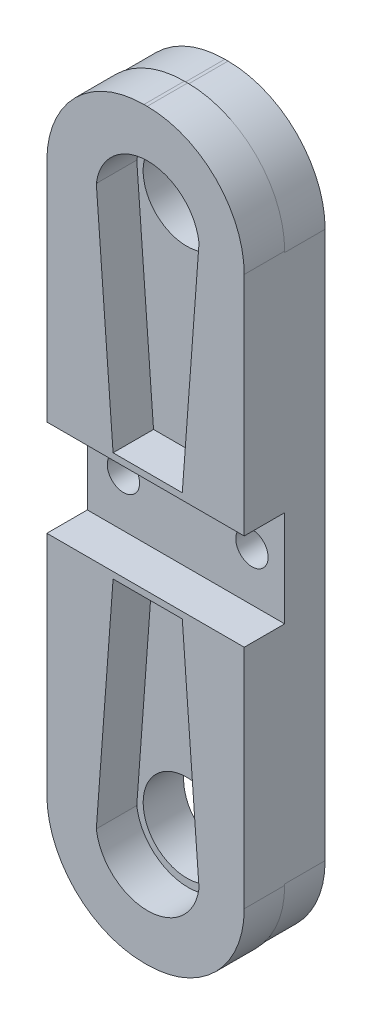
ISO-10303-21;
HEADER;
FILE_DESCRIPTION(('STEP AP214'),'2;1');
FILE_NAME('part.step','',(''),(''),'','','');
FILE_SCHEMA(('AUTOMOTIVE_DESIGN { 1 0 10303 214 1 1 1 1 }'));
ENDSEC;
DATA;
#1=APPLICATION_CONTEXT('core data for automotive mechanical design processes');
#2=APPLICATION_PROTOCOL_DEFINITION('international standard','automotive_design',2000,#1);
#3=PRODUCT_CONTEXT('',#1,'mechanical');
#4=PRODUCT('Part','Part','',(#3));
#5=PRODUCT_RELATED_PRODUCT_CATEGORY('part','',(#4));
#6=PRODUCT_DEFINITION_FORMATION('','',#4);
#7=PRODUCT_DEFINITION_CONTEXT('part definition',#1,'design');
#8=PRODUCT_DEFINITION('design','',#6,#7);
#9=PRODUCT_DEFINITION_SHAPE('','',#8);
#10=(LENGTH_UNIT() NAMED_UNIT(*) SI_UNIT(.MILLI.,.METRE.));
#11=(NAMED_UNIT(*) PLANE_ANGLE_UNIT() SI_UNIT($,.RADIAN.));
#12=(NAMED_UNIT(*) SI_UNIT($,.STERADIAN.) SOLID_ANGLE_UNIT());
#13=UNCERTAINTY_MEASURE_WITH_UNIT(LENGTH_MEASURE(1.E-05),#10,'distance_accuracy_value','');
#14=(GEOMETRIC_REPRESENTATION_CONTEXT(3) GLOBAL_UNCERTAINTY_ASSIGNED_CONTEXT((#13)) GLOBAL_UNIT_ASSIGNED_CONTEXT((#10,
#11,#12)) REPRESENTATION_CONTEXT('',''));
#15=CARTESIAN_POINT('',(0.,0.,0.));
#16=DIRECTION('',(0.,0.,1.));
#17=DIRECTION('',(1.,0.,0.));
#18=AXIS2_PLACEMENT_3D('',#15,#16,#17);
#19=CARTESIAN_POINT('',(0.,0.,12.5));
#20=DIRECTION('',(0.,0.,1.));
#21=DIRECTION('',(1.,0.,0.));
#22=AXIS2_PLACEMENT_3D('',#19,#20,#21);
#23=PLANE('',#22);
#24=CARTESIAN_POINT('',(-185.999682024194,160.057912714201,12.5));
#25=DIRECTION('',(0.,0.,1.));
#26=DIRECTION('',(1.,0.,0.));
#27=AXIS2_PLACEMENT_3D('',#24,#25,#26);
#28=CIRCLE('',#27,1.00000000000002);
#29=CARTESIAN_POINT('',(-184.999682024194,160.057912714201,12.5));
#30=VERTEX_POINT('',#29);
#31=EDGE_CURVE('E298',#30,#30,#28,.T.);
#32=ORIENTED_EDGE('',*,*,#31,.F.);
#33=EDGE_LOOP('',(#32));
#34=FACE_BOUND('',#33,.T.);
#35=CARTESIAN_POINT('',(-178.054871455837,160.057912714201,12.5));
#36=DIRECTION('',(0.,0.,1.));
#37=DIRECTION('',(1.,0.,0.));
#38=AXIS2_PLACEMENT_3D('',#35,#36,#37);
#39=CIRCLE('',#38,0.999999999999998);
#40=CARTESIAN_POINT('',(-177.054871455837,160.057912714201,12.5));
#41=VERTEX_POINT('',#40);
#42=EDGE_CURVE('E260',#41,#41,#39,.T.);
#43=ORIENTED_EDGE('',*,*,#42,.F.);
#44=EDGE_LOOP('',(#43));
#45=FACE_BOUND('',#44,.T.);
#46=DIRECTION('',(0.,-1.,0.));
#47=VECTOR('',#46,1.);
#48=CARTESIAN_POINT('',(-188.231179690793,182.888166790523,12.5));
#49=LINE('',#48,#47);
#50=CARTESIAN_POINT('',(-188.231179690793,162.965455297448,12.5));
#51=VERTEX_POINT('',#50);
#52=CARTESIAN_POINT('',(-188.231179690793,157.010878283599,12.5));
#53=VERTEX_POINT('',#52);
#54=EDGE_CURVE('E360',#51,#53,#49,.T.);
#55=ORIENTED_EDGE('',*,*,#54,.T.);
#56=DIRECTION('',(-1.,0.,0.));
#57=VECTOR('',#56,1.);
#58=CARTESIAN_POINT('',(-176.031179690793,157.010878283599,12.5));
#59=LINE('',#58,#57);
#60=CARTESIAN_POINT('',(-176.031179690793,157.010878283599,12.5));
#61=VERTEX_POINT('',#60);
#62=EDGE_CURVE('E319',#61,#53,#59,.T.);
#63=ORIENTED_EDGE('',*,*,#62,.F.);
#64=DIRECTION('',(0.,1.,0.));
#65=VECTOR('',#64,1.);
#66=CARTESIAN_POINT('',(-176.031179690793,182.888166790523,12.5));
#67=LINE('',#66,#65);
#68=CARTESIAN_POINT('',(-176.031179690793,162.965455297448,12.5));
#69=VERTEX_POINT('',#68);
#70=EDGE_CURVE('E366',#61,#69,#67,.T.);
#71=ORIENTED_EDGE('',*,*,#70,.T.);
#72=DIRECTION('',(1.,0.,0.));
#73=VECTOR('',#72,1.);
#74=CARTESIAN_POINT('',(-176.031179690793,162.965455297448,12.5));
#75=LINE('',#74,#73);
#76=EDGE_CURVE('E337',#51,#69,#75,.T.);
#77=ORIENTED_EDGE('',*,*,#76,.F.);
#78=EDGE_LOOP('',(#55,#63,#71,#77));
#79=FACE_BOUND('',#78,.T.);
#80=ADVANCED_FACE('F37',(#34,#45,#79),#23,.T.);
#81=CARTESIAN_POINT('',(-188.231179690793,182.888166790523,12.5));
#82=DIRECTION('',(1.,0.,0.));
#83=DIRECTION('',(0.,0.,-1.));
#84=AXIS2_PLACEMENT_3D('',#81,#82,#83);
#85=PLANE('',#84);
#86=DIRECTION('',(0.,-1.,0.));
#87=VECTOR('',#86,1.);
#88=CARTESIAN_POINT('',(-188.231179690793,157.010878283599,12.5));
#89=LINE('',#88,#87);
#90=CARTESIAN_POINT('',(-188.231179690793,143.088166790523,12.5));
#91=VERTEX_POINT('',#90);
#92=CARTESIAN_POINT('',(-188.231179690793,143.010878283599,12.5));
#93=VERTEX_POINT('',#92);
#94=EDGE_CURVE('E322',#91,#93,#89,.T.);
#95=ORIENTED_EDGE('',*,*,#94,.T.);
#96=DIRECTION('',(0.,0.,-1.));
#97=VECTOR('',#96,1.);
#98=CARTESIAN_POINT('',(-188.231179690793,143.010878283599,12.5));
#99=LINE('',#98,#97);
#100=CARTESIAN_POINT('',(-188.231179690793,143.010878283599,15.));
#101=VERTEX_POINT('',#100);
#102=EDGE_CURVE('E433',#93,#101,#99,.F.);
#103=ORIENTED_EDGE('',*,*,#102,.T.);
#104=DIRECTION('',(0.,-1.,0.));
#105=VECTOR('',#104,1.);
#106=CARTESIAN_POINT('',(-188.231179690793,157.010878283599,15.));
#107=LINE('',#106,#105);
#108=CARTESIAN_POINT('',(-188.231179690793,157.010878283599,15.));
#109=VERTEX_POINT('',#108);
#110=EDGE_CURVE('E311',#109,#101,#107,.T.);
#111=ORIENTED_EDGE('',*,*,#110,.F.);
#112=DIRECTION('',(0.,0.,-1.));
#113=VECTOR('',#112,1.);
#114=CARTESIAN_POINT('',(-188.231179690793,157.010878283599,15.));
#115=LINE('',#114,#113);
#116=EDGE_CURVE('E317',#109,#53,#115,.T.);
#117=ORIENTED_EDGE('',*,*,#116,.T.);
#118=ORIENTED_EDGE('',*,*,#54,.F.);
#119=DIRECTION('',(0.,0.,-1.));
#120=VECTOR('',#119,1.);
#121=CARTESIAN_POINT('',(-188.231179690793,162.965455297448,15.));
#122=LINE('',#121,#120);
#123=CARTESIAN_POINT('',(-188.231179690793,162.965455297448,15.));
#124=VERTEX_POINT('',#123);
#125=EDGE_CURVE('E356',#124,#51,#122,.T.);
#126=ORIENTED_EDGE('',*,*,#125,.F.);
#127=DIRECTION('',(0.,-1.,0.));
#128=VECTOR('',#127,1.);
#129=CARTESIAN_POINT('',(-188.231179690793,162.965455297448,15.));
#130=LINE('',#129,#128);
#131=CARTESIAN_POINT('',(-188.231179690793,176.965455297448,15.));
#132=VERTEX_POINT('',#131);
#133=EDGE_CURVE('E340',#132,#124,#130,.T.);
#134=ORIENTED_EDGE('',*,*,#133,.F.);
#135=DIRECTION('',(0.,0.,-1.));
#136=VECTOR('',#135,1.);
#137=CARTESIAN_POINT('',(-188.231179690793,176.965455297448,12.5));
#138=LINE('',#137,#136);
#139=CARTESIAN_POINT('',(-188.231179690793,176.965455297448,12.5));
#140=VERTEX_POINT('',#139);
#141=EDGE_CURVE('E430',#132,#140,#138,.T.);
#142=ORIENTED_EDGE('',*,*,#141,.T.);
#143=DIRECTION('',(0.,-1.,0.));
#144=VECTOR('',#143,1.);
#145=CARTESIAN_POINT('',(-188.231179690793,162.965455297448,12.5));
#146=LINE('',#145,#144);
#147=CARTESIAN_POINT('',(-188.231179690793,176.888166790523,12.5));
#148=VERTEX_POINT('',#147);
#149=EDGE_CURVE('E350',#140,#148,#146,.T.);
#150=ORIENTED_EDGE('',*,*,#149,.T.);
#151=DIRECTION('',(0.,0.,-1.));
#152=VECTOR('',#151,1.);
#153=CARTESIAN_POINT('',(-188.231179690793,176.888166790523,12.5));
#154=LINE('',#153,#152);
#155=CARTESIAN_POINT('',(-188.231179690793,176.888166790523,10.));
#156=VERTEX_POINT('',#155);
#157=EDGE_CURVE('E411',#148,#156,#154,.T.);
#158=ORIENTED_EDGE('',*,*,#157,.T.);
#159=DIRECTION('',(0.,-1.,0.));
#160=VECTOR('',#159,1.);
#161=CARTESIAN_POINT('',(-188.231179690793,182.888166790523,10.));
#162=LINE('',#161,#160);
#163=CARTESIAN_POINT('',(-188.231179690793,143.088166790523,10.));
#164=VERTEX_POINT('',#163);
#165=EDGE_CURVE('E359',#156,#164,#162,.T.);
#166=ORIENTED_EDGE('',*,*,#165,.T.);
#167=DIRECTION('',(0.,0.,-1.));
#168=VECTOR('',#167,1.);
#169=CARTESIAN_POINT('',(-188.231179690793,143.088166790523,12.5));
#170=LINE('',#169,#168);
#171=EDGE_CURVE('E414',#164,#91,#170,.F.);
#172=ORIENTED_EDGE('',*,*,#171,.T.);
#173=EDGE_LOOP('',(#95,#103,#111,#117,#118,#126,#134,#142,#150,#158,#166,#172));
#174=FACE_BOUND('',#173,.T.);
#175=ADVANCED_FACE('F488',(#174),#85,.F.);
#176=CARTESIAN_POINT('',(-188.231179690793,137.088166790523,12.5));
#177=DIRECTION('',(0.,1.,0.));
#178=DIRECTION('',(0.,0.,1.));
#179=AXIS2_PLACEMENT_3D('',#176,#177,#178);
#180=PLANE('',#179);
#181=DIRECTION('',(1.,0.,0.));
#182=VECTOR('',#181,1.);
#183=CARTESIAN_POINT('',(-188.231179690793,137.088166790523,10.));
#184=LINE('',#183,#182);
#185=CARTESIAN_POINT('',(-182.231179690793,137.088166790523,10.));
#186=VERTEX_POINT('',#185);
#187=CARTESIAN_POINT('',(-182.031179690793,137.088166790523,10.));
#188=VERTEX_POINT('',#187);
#189=EDGE_CURVE('E374',#186,#188,#184,.T.);
#190=ORIENTED_EDGE('',*,*,#189,.T.);
#191=DIRECTION('',(0.,0.,-1.));
#192=VECTOR('',#191,1.);
#193=CARTESIAN_POINT('',(-182.031179690793,137.088166790523,12.5));
#194=LINE('',#193,#192);
#195=CARTESIAN_POINT('',(-182.031179690793,137.088166790523,12.5));
#196=VERTEX_POINT('',#195);
#197=EDGE_CURVE('E397',#188,#196,#194,.F.);
#198=ORIENTED_EDGE('',*,*,#197,.T.);
#199=DIRECTION('',(1.,0.,0.));
#200=VECTOR('',#199,1.);
#201=CARTESIAN_POINT('',(-188.231179690793,137.088166790523,12.5));
#202=LINE('',#201,#200);
#203=CARTESIAN_POINT('',(-182.231179690793,137.088166790523,12.5));
#204=VERTEX_POINT('',#203);
#205=EDGE_CURVE('E362',#204,#196,#202,.T.);
#206=ORIENTED_EDGE('',*,*,#205,.F.);
#207=DIRECTION('',(0.,0.,-1.));
#208=VECTOR('',#207,1.);
#209=CARTESIAN_POINT('',(-182.231179690793,137.088166790523,12.5));
#210=LINE('',#209,#208);
#211=EDGE_CURVE('E394',#204,#186,#210,.T.);
#212=ORIENTED_EDGE('',*,*,#211,.T.);
#213=EDGE_LOOP('',(#190,#198,#206,#212));
#214=FACE_BOUND('',#213,.T.);
#215=ADVANCED_FACE('F498',(#214),#180,.F.);
#216=CARTESIAN_POINT('',(-176.031179690793,182.888166790523,12.5));
#217=DIRECTION('',(-1.,0.,0.));
#218=DIRECTION('',(0.,0.,1.));
#219=AXIS2_PLACEMENT_3D('',#216,#217,#218);
#220=PLANE('',#219);
#221=DIRECTION('',(0.,1.,0.));
#222=VECTOR('',#221,1.);
#223=CARTESIAN_POINT('',(-176.031179690793,157.010878283599,15.));
#224=LINE('',#223,#222);
#225=CARTESIAN_POINT('',(-176.031179690793,143.010878283599,15.));
#226=VERTEX_POINT('',#225);
#227=CARTESIAN_POINT('',(-176.031179690793,157.010878283599,15.));
#228=VERTEX_POINT('',#227);
#229=EDGE_CURVE('E306',#226,#228,#224,.T.);
#230=ORIENTED_EDGE('',*,*,#229,.F.);
#231=DIRECTION('',(0.,0.,-1.));
#232=VECTOR('',#231,1.);
#233=CARTESIAN_POINT('',(-176.031179690793,143.010878283599,12.5));
#234=LINE('',#233,#232);
#235=CARTESIAN_POINT('',(-176.031179690793,143.010878283599,12.5));
#236=VERTEX_POINT('',#235);
#237=EDGE_CURVE('E441',#226,#236,#234,.T.);
#238=ORIENTED_EDGE('',*,*,#237,.T.);
#239=DIRECTION('',(0.,1.,0.));
#240=VECTOR('',#239,1.);
#241=CARTESIAN_POINT('',(-176.031179690793,157.010878283599,12.5));
#242=LINE('',#241,#240);
#243=CARTESIAN_POINT('',(-176.031179690793,143.088166790523,12.5));
#244=VERTEX_POINT('',#243);
#245=EDGE_CURVE('E297',#236,#244,#242,.T.);
#246=ORIENTED_EDGE('',*,*,#245,.T.);
#247=DIRECTION('',(0.,0.,-1.));
#248=VECTOR('',#247,1.);
#249=CARTESIAN_POINT('',(-176.031179690793,143.088166790523,12.5));
#250=LINE('',#249,#248);
#251=CARTESIAN_POINT('',(-176.031179690793,143.088166790523,10.));
#252=VERTEX_POINT('',#251);
#253=EDGE_CURVE('E383',#244,#252,#250,.T.);
#254=ORIENTED_EDGE('',*,*,#253,.T.);
#255=DIRECTION('',(0.,1.,0.));
#256=VECTOR('',#255,1.);
#257=CARTESIAN_POINT('',(-176.031179690793,182.888166790523,10.));
#258=LINE('',#257,#256);
#259=CARTESIAN_POINT('',(-176.031179690793,176.888166790523,10.));
#260=VERTEX_POINT('',#259);
#261=EDGE_CURVE('E377',#252,#260,#258,.T.);
#262=ORIENTED_EDGE('',*,*,#261,.T.);
#263=DIRECTION('',(0.,0.,-1.));
#264=VECTOR('',#263,1.);
#265=CARTESIAN_POINT('',(-176.031179690793,176.888166790523,12.5));
#266=LINE('',#265,#264);
#267=CARTESIAN_POINT('',(-176.031179690793,176.888166790523,12.5));
#268=VERTEX_POINT('',#267);
#269=EDGE_CURVE('E371',#260,#268,#266,.F.);
#270=ORIENTED_EDGE('',*,*,#269,.T.);
#271=DIRECTION('',(0.,1.,0.));
#272=VECTOR('',#271,1.);
#273=CARTESIAN_POINT('',(-176.031179690793,162.965455297448,12.5));
#274=LINE('',#273,#272);
#275=CARTESIAN_POINT('',(-176.031179690793,176.965455297448,12.5));
#276=VERTEX_POINT('',#275);
#277=EDGE_CURVE('E332',#268,#276,#274,.T.);
#278=ORIENTED_EDGE('',*,*,#277,.T.);
#279=DIRECTION('',(0.,0.,-1.));
#280=VECTOR('',#279,1.);
#281=CARTESIAN_POINT('',(-176.031179690793,176.965455297448,12.5));
#282=LINE('',#281,#280);
#283=CARTESIAN_POINT('',(-176.031179690793,176.965455297448,15.));
#284=VERTEX_POINT('',#283);
#285=EDGE_CURVE('E439',#276,#284,#282,.F.);
#286=ORIENTED_EDGE('',*,*,#285,.T.);
#287=DIRECTION('',(0.,1.,0.));
#288=VECTOR('',#287,1.);
#289=CARTESIAN_POINT('',(-176.031179690793,162.965455297448,15.));
#290=LINE('',#289,#288);
#291=CARTESIAN_POINT('',(-176.031179690793,162.965455297448,15.));
#292=VERTEX_POINT('',#291);
#293=EDGE_CURVE('E333',#292,#284,#290,.T.);
#294=ORIENTED_EDGE('',*,*,#293,.F.);
#295=DIRECTION('',(0.,0.,-1.));
#296=VECTOR('',#295,1.);
#297=CARTESIAN_POINT('',(-176.031179690793,162.965455297448,15.));
#298=LINE('',#297,#296);
#299=EDGE_CURVE('E344',#292,#69,#298,.T.);
#300=ORIENTED_EDGE('',*,*,#299,.T.);
#301=ORIENTED_EDGE('',*,*,#70,.F.);
#302=DIRECTION('',(0.,0.,-1.));
#303=VECTOR('',#302,1.);
#304=CARTESIAN_POINT('',(-176.031179690793,157.010878283599,15.));
#305=LINE('',#304,#303);
#306=EDGE_CURVE('E329',#228,#61,#305,.T.);
#307=ORIENTED_EDGE('',*,*,#306,.F.);
#308=EDGE_LOOP('',(#230,#238,#246,#254,#262,#270,#278,#286,#294,#300,#301,#307));
#309=FACE_BOUND('',#308,.T.);
#310=ADVANCED_FACE('F471',(#309),#220,.F.);
#311=CARTESIAN_POINT('',(-188.231179690793,182.888166790523,12.5));
#312=DIRECTION('',(0.,-1.,0.));
#313=DIRECTION('',(0.,0.,-1.));
#314=AXIS2_PLACEMENT_3D('',#311,#312,#313);
#315=PLANE('',#314);
#316=DIRECTION('',(-1.,0.,0.));
#317=VECTOR('',#316,1.);
#318=CARTESIAN_POINT('',(-188.231179690793,182.888166790523,12.5));
#319=LINE('',#318,#317);
#320=CARTESIAN_POINT('',(-182.031179690793,182.888166790523,12.5));
#321=VERTEX_POINT('',#320);
#322=CARTESIAN_POINT('',(-182.231179690793,182.888166790523,12.5));
#323=VERTEX_POINT('',#322);
#324=EDGE_CURVE('E368',#321,#323,#319,.T.);
#325=ORIENTED_EDGE('',*,*,#324,.F.);
#326=DIRECTION('',(0.,0.,-1.));
#327=VECTOR('',#326,1.);
#328=CARTESIAN_POINT('',(-182.031179690793,182.888166790523,12.5));
#329=LINE('',#328,#327);
#330=CARTESIAN_POINT('',(-182.031179690793,182.888166790523,10.));
#331=VERTEX_POINT('',#330);
#332=EDGE_CURVE('E418',#321,#331,#329,.T.);
#333=ORIENTED_EDGE('',*,*,#332,.T.);
#334=DIRECTION('',(-1.,0.,0.));
#335=VECTOR('',#334,1.);
#336=CARTESIAN_POINT('',(-188.231179690793,182.888166790523,10.));
#337=LINE('',#336,#335);
#338=CARTESIAN_POINT('',(-182.231179690793,182.888166790523,10.));
#339=VERTEX_POINT('',#338);
#340=EDGE_CURVE('E363',#331,#339,#337,.T.);
#341=ORIENTED_EDGE('',*,*,#340,.T.);
#342=DIRECTION('',(0.,0.,-1.));
#343=VECTOR('',#342,1.);
#344=CARTESIAN_POINT('',(-182.231179690793,182.888166790523,12.5));
#345=LINE('',#344,#343);
#346=EDGE_CURVE('E416',#339,#323,#345,.F.);
#347=ORIENTED_EDGE('',*,*,#346,.T.);
#348=EDGE_LOOP('',(#325,#333,#341,#347));
#349=FACE_BOUND('',#348,.T.);
#350=ADVANCED_FACE('F480',(#349),#315,.F.);
#351=CARTESIAN_POINT('',(0.,0.,10.));
#352=DIRECTION('',(0.,0.,1.));
#353=DIRECTION('',(1.,0.,0.));
#354=AXIS2_PLACEMENT_3D('',#351,#352,#353);
#355=PLANE('',#354);
#356=CARTESIAN_POINT('',(-182.080577921619,176.900168290309,10.));
#357=DIRECTION('',(0.,0.,1.));
#358=DIRECTION('',(1.,0.,0.));
#359=AXIS2_PLACEMENT_3D('',#356,#357,#358);
#360=CIRCLE('',#359,2.70000000000001);
#361=CARTESIAN_POINT('',(-179.380577921619,176.900168290309,10.));
#362=VERTEX_POINT('',#361);
#363=EDGE_CURVE('E280',#362,#362,#360,.T.);
#364=ORIENTED_EDGE('',*,*,#363,.T.);
#365=EDGE_LOOP('',(#364));
#366=FACE_BOUND('',#365,.T.);
#367=CARTESIAN_POINT('',(-182.080577921619,143.076165290738,10.));
#368=DIRECTION('',(0.,0.,1.));
#369=DIRECTION('',(-1.,0.,0.));
#370=AXIS2_PLACEMENT_3D('',#367,#368,#369);
#371=CIRCLE('',#370,2.70000000000001);
#372=CARTESIAN_POINT('',(-184.780577921619,143.076165290738,10.));
#373=VERTEX_POINT('',#372);
#374=EDGE_CURVE('E883',#373,#373,#371,.T.);
#375=ORIENTED_EDGE('',*,*,#374,.T.);
#376=EDGE_LOOP('',(#375));
#377=FACE_BOUND('',#376,.T.);
#378=CARTESIAN_POINT('',(-185.999682024194,160.057912714201,10.));
#379=DIRECTION('',(0.,0.,1.));
#380=DIRECTION('',(1.,0.,0.));
#381=AXIS2_PLACEMENT_3D('',#378,#379,#380);
#382=CIRCLE('',#381,1.00000000000002);
#383=CARTESIAN_POINT('',(-184.999682024194,160.057912714201,10.));
#384=VERTEX_POINT('',#383);
#385=EDGE_CURVE('E294',#384,#384,#382,.T.);
#386=ORIENTED_EDGE('',*,*,#385,.T.);
#387=EDGE_LOOP('',(#386));
#388=FACE_BOUND('',#387,.T.);
#389=CARTESIAN_POINT('',(-178.054871455837,160.057912714201,10.));
#390=DIRECTION('',(0.,0.,1.));
#391=DIRECTION('',(1.,0.,0.));
#392=AXIS2_PLACEMENT_3D('',#389,#390,#391);
#393=CIRCLE('',#392,0.999999999999998);
#394=CARTESIAN_POINT('',(-177.054871455837,160.057912714201,10.));
#395=VERTEX_POINT('',#394);
#396=EDGE_CURVE('E301',#395,#395,#393,.T.);
#397=ORIENTED_EDGE('',*,*,#396,.T.);
#398=EDGE_LOOP('',(#397));
#399=FACE_BOUND('',#398,.T.);
#400=ORIENTED_EDGE('',*,*,#261,.F.);
#401=CARTESIAN_POINT('',(-182.031179690793,143.088166790523,10.));
#402=DIRECTION('',(0.,0.,1.));
#403=DIRECTION('',(1.,0.,0.));
#404=AXIS2_PLACEMENT_3D('',#401,#402,#403);
#405=CIRCLE('',#404,6.);
#406=EDGE_CURVE('E392',#252,#188,#405,.F.);
#407=ORIENTED_EDGE('',*,*,#406,.T.);
#408=ORIENTED_EDGE('',*,*,#189,.F.);
#409=CARTESIAN_POINT('',(-182.231179690793,143.088166790523,10.));
#410=DIRECTION('',(0.,0.,1.));
#411=DIRECTION('',(1.,0.,0.));
#412=AXIS2_PLACEMENT_3D('',#409,#410,#411);
#413=CIRCLE('',#412,6.);
#414=EDGE_CURVE('E390',#186,#164,#413,.F.);
#415=ORIENTED_EDGE('',*,*,#414,.T.);
#416=ORIENTED_EDGE('',*,*,#165,.F.);
#417=CARTESIAN_POINT('',(-182.231179690793,176.888166790523,10.));
#418=DIRECTION('',(0.,0.,1.));
#419=DIRECTION('',(1.,0.,0.));
#420=AXIS2_PLACEMENT_3D('',#417,#418,#419);
#421=CIRCLE('',#420,6.);
#422=EDGE_CURVE('E386',#156,#339,#421,.F.);
#423=ORIENTED_EDGE('',*,*,#422,.T.);
#424=ORIENTED_EDGE('',*,*,#340,.F.);
#425=CARTESIAN_POINT('',(-182.031179690793,176.888166790523,10.));
#426=DIRECTION('',(0.,0.,1.));
#427=DIRECTION('',(1.,0.,0.));
#428=AXIS2_PLACEMENT_3D('',#425,#426,#427);
#429=CIRCLE('',#428,6.);
#430=EDGE_CURVE('E388',#331,#260,#429,.F.);
#431=ORIENTED_EDGE('',*,*,#430,.T.);
#432=EDGE_LOOP('',(#400,#407,#408,#415,#416,#423,#424,#431));
#433=FACE_BOUND('',#432,.T.);
#434=ADVANCED_FACE('F491',(#366,#377,#388,#399,#433),#355,.F.);
#435=CARTESIAN_POINT('',(-182.031179690793,143.088166790523,12.5));
#436=DIRECTION('',(0.,0.,-1.));
#437=DIRECTION('',(-1.,0.,0.));
#438=AXIS2_PLACEMENT_3D('',#435,#436,#437);
#439=CYLINDRICAL_SURFACE('',#438,6.);
#440=CARTESIAN_POINT('',(-182.031179690793,143.088166790523,12.5));
#441=DIRECTION('',(0.,0.,1.));
#442=DIRECTION('',(1.,0.,0.));
#443=AXIS2_PLACEMENT_3D('',#440,#441,#442);
#444=CIRCLE('',#443,6.);
#445=EDGE_CURVE('E408',#196,#244,#444,.T.);
#446=ORIENTED_EDGE('',*,*,#445,.F.);
#447=ORIENTED_EDGE('',*,*,#197,.F.);
#448=ORIENTED_EDGE('',*,*,#406,.F.);
#449=ORIENTED_EDGE('',*,*,#253,.F.);
#450=EDGE_LOOP('',(#446,#447,#448,#449));
#451=FACE_BOUND('',#450,.T.);
#452=ADVANCED_FACE('F560',(#451),#439,.T.);
#453=CARTESIAN_POINT('',(-182.231179690793,143.088166790523,12.5));
#454=DIRECTION('',(0.,0.,-1.));
#455=DIRECTION('',(-1.,0.,0.));
#456=AXIS2_PLACEMENT_3D('',#453,#454,#455);
#457=CYLINDRICAL_SURFACE('',#456,6.);
#458=CARTESIAN_POINT('',(-182.231179690793,143.088166790523,12.5));
#459=DIRECTION('',(0.,0.,1.));
#460=DIRECTION('',(1.,0.,0.));
#461=AXIS2_PLACEMENT_3D('',#458,#459,#460);
#462=CIRCLE('',#461,6.);
#463=EDGE_CURVE('E405',#91,#204,#462,.T.);
#464=ORIENTED_EDGE('',*,*,#463,.F.);
#465=ORIENTED_EDGE('',*,*,#171,.F.);
#466=ORIENTED_EDGE('',*,*,#414,.F.);
#467=ORIENTED_EDGE('',*,*,#211,.F.);
#468=EDGE_LOOP('',(#464,#465,#466,#467));
#469=FACE_BOUND('',#468,.T.);
#470=ADVANCED_FACE('F495',(#469),#457,.T.);
#471=CARTESIAN_POINT('',(-182.031179690793,176.888166790523,12.5));
#472=DIRECTION('',(0.,0.,-1.));
#473=DIRECTION('',(-1.,0.,0.));
#474=AXIS2_PLACEMENT_3D('',#471,#472,#473);
#475=CYLINDRICAL_SURFACE('',#474,6.);
#476=CARTESIAN_POINT('',(-182.031179690793,176.888166790523,12.5));
#477=DIRECTION('',(0.,0.,1.));
#478=DIRECTION('',(1.,0.,0.));
#479=AXIS2_PLACEMENT_3D('',#476,#477,#478);
#480=CIRCLE('',#479,6.);
#481=EDGE_CURVE('E402',#268,#321,#480,.T.);
#482=ORIENTED_EDGE('',*,*,#481,.F.);
#483=ORIENTED_EDGE('',*,*,#269,.F.);
#484=ORIENTED_EDGE('',*,*,#430,.F.);
#485=ORIENTED_EDGE('',*,*,#332,.F.);
#486=EDGE_LOOP('',(#482,#483,#484,#485));
#487=FACE_BOUND('',#486,.T.);
#488=ADVANCED_FACE('F477',(#487),#475,.T.);
#489=CARTESIAN_POINT('',(-182.231179690793,176.888166790523,12.5));
#490=DIRECTION('',(0.,0.,-1.));
#491=DIRECTION('',(-1.,0.,0.));
#492=AXIS2_PLACEMENT_3D('',#489,#490,#491);
#493=CYLINDRICAL_SURFACE('',#492,6.);
#494=CARTESIAN_POINT('',(-182.231179690793,176.888166790523,12.5));
#495=DIRECTION('',(0.,0.,1.));
#496=DIRECTION('',(1.,0.,0.));
#497=AXIS2_PLACEMENT_3D('',#494,#495,#496);
#498=CIRCLE('',#497,6.);
#499=EDGE_CURVE('E399',#323,#148,#498,.T.);
#500=ORIENTED_EDGE('',*,*,#499,.F.);
#501=ORIENTED_EDGE('',*,*,#346,.F.);
#502=ORIENTED_EDGE('',*,*,#422,.F.);
#503=ORIENTED_EDGE('',*,*,#157,.F.);
#504=EDGE_LOOP('',(#500,#501,#502,#503));
#505=FACE_BOUND('',#504,.T.);
#506=ADVANCED_FACE('F485',(#505),#493,.T.);
#507=CARTESIAN_POINT('',(0.,0.,12.5));
#508=DIRECTION('',(0.,0.,1.));
#509=DIRECTION('',(1.,0.,0.));
#510=AXIS2_PLACEMENT_3D('',#507,#508,#509);
#511=PLANE('',#510);
#512=ORIENTED_EDGE('',*,*,#149,.F.);
#513=CARTESIAN_POINT('',(-182.231179690793,176.965455297448,12.5));
#514=DIRECTION('',(0.,0.,1.));
#515=DIRECTION('',(1.,0.,0.));
#516=AXIS2_PLACEMENT_3D('',#513,#514,#515);
#517=CIRCLE('',#516,6.);
#518=CARTESIAN_POINT('',(-182.231179690793,182.965455297448,12.5));
#519=VERTEX_POINT('',#518);
#520=EDGE_CURVE('E446',#140,#519,#517,.F.);
#521=ORIENTED_EDGE('',*,*,#520,.T.);
#522=DIRECTION('',(-1.,0.,0.));
#523=VECTOR('',#522,1.);
#524=CARTESIAN_POINT('',(-176.031179690793,182.965455297448,12.5));
#525=LINE('',#524,#523);
#526=CARTESIAN_POINT('',(-182.031179690793,182.965455297448,12.5));
#527=VERTEX_POINT('',#526);
#528=EDGE_CURVE('E347',#527,#519,#525,.T.);
#529=ORIENTED_EDGE('',*,*,#528,.F.);
#530=CARTESIAN_POINT('',(-182.031179690793,176.965455297448,12.5));
#531=DIRECTION('',(0.,0.,1.));
#532=DIRECTION('',(1.,0.,0.));
#533=AXIS2_PLACEMENT_3D('',#530,#531,#532);
#534=CIRCLE('',#533,6.);
#535=EDGE_CURVE('E444',#527,#276,#534,.F.);
#536=ORIENTED_EDGE('',*,*,#535,.T.);
#537=ORIENTED_EDGE('',*,*,#277,.F.);
#538=ORIENTED_EDGE('',*,*,#481,.T.);
#539=ORIENTED_EDGE('',*,*,#324,.T.);
#540=ORIENTED_EDGE('',*,*,#499,.T.);
#541=EDGE_LOOP('',(#512,#521,#529,#536,#537,#538,#539,#540));
#542=FACE_BOUND('',#541,.T.);
#543=ADVANCED_FACE('F468',(#542),#511,.F.);
#544=CARTESIAN_POINT('',(-176.031179690793,182.965455297448,15.));
#545=DIRECTION('',(0.,-1.,0.));
#546=DIRECTION('',(0.,0.,-1.));
#547=AXIS2_PLACEMENT_3D('',#544,#545,#546);
#548=PLANE('',#547);
#549=ORIENTED_EDGE('',*,*,#528,.T.);
#550=DIRECTION('',(0.,0.,-1.));
#551=VECTOR('',#550,1.);
#552=CARTESIAN_POINT('',(-182.231179690793,182.965455297448,15.));
#553=LINE('',#552,#551);
#554=CARTESIAN_POINT('',(-182.231179690793,182.965455297448,15.));
#555=VERTEX_POINT('',#554);
#556=EDGE_CURVE('E451',#519,#555,#553,.F.);
#557=ORIENTED_EDGE('',*,*,#556,.T.);
#558=DIRECTION('',(-1.,0.,0.));
#559=VECTOR('',#558,1.);
#560=CARTESIAN_POINT('',(-176.031179690793,182.965455297448,15.));
#561=LINE('',#560,#559);
#562=CARTESIAN_POINT('',(-182.031179690793,182.965455297448,15.));
#563=VERTEX_POINT('',#562);
#564=EDGE_CURVE('E336',#563,#555,#561,.T.);
#565=ORIENTED_EDGE('',*,*,#564,.F.);
#566=DIRECTION('',(0.,0.,-1.));
#567=VECTOR('',#566,1.);
#568=CARTESIAN_POINT('',(-182.031179690793,182.965455297448,15.));
#569=LINE('',#568,#567);
#570=EDGE_CURVE('E448',#563,#527,#569,.T.);
#571=ORIENTED_EDGE('',*,*,#570,.T.);
#572=EDGE_LOOP('',(#549,#557,#565,#571));
#573=FACE_BOUND('',#572,.T.);
#574=ADVANCED_FACE('F462',(#573),#548,.F.);
#575=CARTESIAN_POINT('',(-176.031179690793,162.965455297448,15.));
#576=DIRECTION('',(0.,1.,0.));
#577=DIRECTION('',(0.,0.,1.));
#578=AXIS2_PLACEMENT_3D('',#575,#576,#577);
#579=PLANE('',#578);
#580=ORIENTED_EDGE('',*,*,#76,.T.);
#581=ORIENTED_EDGE('',*,*,#299,.F.);
#582=DIRECTION('',(1.,0.,0.));
#583=VECTOR('',#582,1.);
#584=CARTESIAN_POINT('',(-176.031179690793,162.965455297448,15.));
#585=LINE('',#584,#583);
#586=EDGE_CURVE('E342',#124,#292,#585,.T.);
#587=ORIENTED_EDGE('',*,*,#586,.F.);
#588=ORIENTED_EDGE('',*,*,#125,.T.);
#589=EDGE_LOOP('',(#580,#581,#587,#588));
#590=FACE_BOUND('',#589,.T.);
#591=ADVANCED_FACE('F534',(#590),#579,.F.);
#592=CARTESIAN_POINT('',(0.,0.,15.));
#593=DIRECTION('',(0.,0.,1.));
#594=DIRECTION('',(1.,0.,0.));
#595=AXIS2_PLACEMENT_3D('',#592,#593,#594);
#596=PLANE('',#595);
#597=DIRECTION('',(0.074379950661477,-0.997229974950411,0.));
#598=VECTOR('',#597,1.);
#599=CARTESIAN_POINT('',(-184.138427734375,163.365707397461,15.));
#600=LINE('',#599,#598);
#601=CARTESIAN_POINT('',(-185.175109863281,177.264755249023,15.));
#602=VERTEX_POINT('',#601);
#603=CARTESIAN_POINT('',(-184.138427734375,163.365707397461,15.));
#604=VERTEX_POINT('',#603);
#605=EDGE_CURVE('E52',#602,#604,#600,.T.);
#606=ORIENTED_EDGE('',*,*,#605,.F.);
#607=CARTESIAN_POINT('',(-182.,176.858526491128,15.));
#608=DIRECTION('',(0.,0.,1.));
#609=DIRECTION('',(-1.,0.,0.));
#610=AXIS2_PLACEMENT_3D('',#607,#608,#609);
#611=CIRCLE('',#610,3.2009911664431);
#612=CARTESIAN_POINT('',(-178.824890136719,177.264755249023,15.));
#613=VERTEX_POINT('',#612);
#614=EDGE_CURVE('E241',#613,#602,#611,.T.);
#615=ORIENTED_EDGE('',*,*,#614,.F.);
#616=DIRECTION('',(0.074379950661475,0.997229974950411,0.));
#617=VECTOR('',#616,1.);
#618=CARTESIAN_POINT('',(-179.861572265625,163.365707397461,15.));
#619=LINE('',#618,#617);
#620=CARTESIAN_POINT('',(-179.861572265625,163.365707397461,15.));
#621=VERTEX_POINT('',#620);
#622=EDGE_CURVE('E244',#621,#613,#619,.T.);
#623=ORIENTED_EDGE('',*,*,#622,.F.);
#624=DIRECTION('',(1.,0.,0.));
#625=VECTOR('',#624,1.);
#626=CARTESIAN_POINT('',(-184.138427734375,163.365707397461,15.));
#627=LINE('',#626,#625);
#628=EDGE_CURVE('E253',#604,#621,#627,.T.);
#629=ORIENTED_EDGE('',*,*,#628,.F.);
#630=EDGE_LOOP('',(#606,#615,#623,#629));
#631=FACE_BOUND('',#630,.T.);
#632=ORIENTED_EDGE('',*,*,#564,.T.);
#633=CARTESIAN_POINT('',(-182.231179690793,176.965455297448,15.));
#634=DIRECTION('',(0.,0.,1.));
#635=DIRECTION('',(1.,0.,0.));
#636=AXIS2_PLACEMENT_3D('',#633,#634,#635);
#637=CIRCLE('',#636,6.);
#638=EDGE_CURVE('E11',#555,#132,#637,.T.);
#639=ORIENTED_EDGE('',*,*,#638,.T.);
#640=ORIENTED_EDGE('',*,*,#133,.T.);
#641=ORIENTED_EDGE('',*,*,#586,.T.);
#642=ORIENTED_EDGE('',*,*,#293,.T.);
#643=CARTESIAN_POINT('',(-182.031179690793,176.965455297448,15.));
#644=DIRECTION('',(0.,0.,1.));
#645=DIRECTION('',(1.,0.,0.));
#646=AXIS2_PLACEMENT_3D('',#643,#644,#645);
#647=CIRCLE('',#646,6.);
#648=EDGE_CURVE('E45',#284,#563,#647,.T.);
#649=ORIENTED_EDGE('',*,*,#648,.T.);
#650=EDGE_LOOP('',(#632,#639,#640,#641,#642,#649));
#651=FACE_BOUND('',#650,.T.);
#652=ADVANCED_FACE('F455',(#631,#651),#596,.T.);
#653=CARTESIAN_POINT('',(-176.031179690793,157.010878283599,15.));
#654=DIRECTION('',(0.,-1.,0.));
#655=DIRECTION('',(0.,0.,-1.));
#656=AXIS2_PLACEMENT_3D('',#653,#654,#655);
#657=PLANE('',#656);
#658=ORIENTED_EDGE('',*,*,#62,.T.);
#659=ORIENTED_EDGE('',*,*,#116,.F.);
#660=DIRECTION('',(-1.,0.,0.));
#661=VECTOR('',#660,1.);
#662=CARTESIAN_POINT('',(-176.031179690793,157.010878283599,15.));
#663=LINE('',#662,#661);
#664=EDGE_CURVE('E308',#228,#109,#663,.T.);
#665=ORIENTED_EDGE('',*,*,#664,.F.);
#666=ORIENTED_EDGE('',*,*,#306,.T.);
#667=EDGE_LOOP('',(#658,#659,#665,#666));
#668=FACE_BOUND('',#667,.T.);
#669=ADVANCED_FACE('F526',(#668),#657,.F.);
#670=CARTESIAN_POINT('',(-176.031179690793,137.010878283599,15.));
#671=DIRECTION('',(0.,1.,0.));
#672=DIRECTION('',(0.,0.,1.));
#673=AXIS2_PLACEMENT_3D('',#670,#671,#672);
#674=PLANE('',#673);
#675=DIRECTION('',(1.,0.,0.));
#676=VECTOR('',#675,1.);
#677=CARTESIAN_POINT('',(-176.031179690793,137.010878283599,15.));
#678=LINE('',#677,#676);
#679=CARTESIAN_POINT('',(-182.231179690793,137.010878283599,15.));
#680=VERTEX_POINT('',#679);
#681=CARTESIAN_POINT('',(-182.031179690793,137.010878283599,15.));
#682=VERTEX_POINT('',#681);
#683=EDGE_CURVE('E314',#680,#682,#678,.T.);
#684=ORIENTED_EDGE('',*,*,#683,.F.);
#685=DIRECTION('',(0.,0.,-1.));
#686=VECTOR('',#685,1.);
#687=CARTESIAN_POINT('',(-182.231179690793,137.010878283599,15.));
#688=LINE('',#687,#686);
#689=CARTESIAN_POINT('',(-182.231179690793,137.010878283599,12.5));
#690=VERTEX_POINT('',#689);
#691=EDGE_CURVE('E423',#680,#690,#688,.T.);
#692=ORIENTED_EDGE('',*,*,#691,.T.);
#693=DIRECTION('',(1.,0.,0.));
#694=VECTOR('',#693,1.);
#695=CARTESIAN_POINT('',(-176.031179690793,137.010878283599,12.5));
#696=LINE('',#695,#694);
#697=CARTESIAN_POINT('',(-182.031179690793,137.010878283599,12.5));
#698=VERTEX_POINT('',#697);
#699=EDGE_CURVE('E309',#690,#698,#696,.T.);
#700=ORIENTED_EDGE('',*,*,#699,.T.);
#701=DIRECTION('',(0.,0.,-1.));
#702=VECTOR('',#701,1.);
#703=CARTESIAN_POINT('',(-182.031179690793,137.010878283599,15.));
#704=LINE('',#703,#702);
#705=EDGE_CURVE('E421',#698,#682,#704,.F.);
#706=ORIENTED_EDGE('',*,*,#705,.T.);
#707=EDGE_LOOP('',(#684,#692,#700,#706));
#708=FACE_BOUND('',#707,.T.);
#709=ADVANCED_FACE('F516',(#708),#674,.F.);
#710=CARTESIAN_POINT('',(0.,0.,15.));
#711=DIRECTION('',(0.,0.,-1.));
#712=DIRECTION('',(-1.,0.,0.));
#713=AXIS2_PLACEMENT_3D('',#710,#711,#712);
#714=PLANE('',#713);
#715=DIRECTION('',(-0.074379950661477,-0.997229974950411,0.));
#716=VECTOR('',#715,1.);
#717=CARTESIAN_POINT('',(-184.138427734375,156.610626183586,15.));
#718=LINE('',#717,#716);
#719=CARTESIAN_POINT('',(-184.138427734375,156.610626183586,15.));
#720=VERTEX_POINT('',#719);
#721=CARTESIAN_POINT('',(-185.175109863281,142.711578332023,15.));
#722=VERTEX_POINT('',#721);
#723=EDGE_CURVE('E279',#720,#722,#718,.T.);
#724=ORIENTED_EDGE('',*,*,#723,.F.);
#725=DIRECTION('',(-1.,0.,0.));
#726=VECTOR('',#725,1.);
#727=CARTESIAN_POINT('',(-184.138427734375,156.610626183586,15.));
#728=LINE('',#727,#726);
#729=CARTESIAN_POINT('',(-179.861572265625,156.610626183586,15.));
#730=VERTEX_POINT('',#729);
#731=EDGE_CURVE('E60',#730,#720,#728,.T.);
#732=ORIENTED_EDGE('',*,*,#731,.F.);
#733=DIRECTION('',(-0.074379950661475,0.997229974950411,0.));
#734=VECTOR('',#733,1.);
#735=CARTESIAN_POINT('',(-179.861572265625,156.610626183586,15.));
#736=LINE('',#735,#734);
#737=CARTESIAN_POINT('',(-178.824890136719,142.711578332023,15.));
#738=VERTEX_POINT('',#737);
#739=EDGE_CURVE('E268',#738,#730,#736,.T.);
#740=ORIENTED_EDGE('',*,*,#739,.F.);
#741=CARTESIAN_POINT('',(-182.,143.117807089918,15.));
#742=DIRECTION('',(0.,0.,1.));
#743=DIRECTION('',(1.,0.,0.));
#744=AXIS2_PLACEMENT_3D('',#741,#742,#743);
#745=CIRCLE('',#744,3.2009911664431);
#746=EDGE_CURVE('E283',#722,#738,#745,.T.);
#747=ORIENTED_EDGE('',*,*,#746,.F.);
#748=EDGE_LOOP('',(#724,#732,#740,#747));
#749=FACE_BOUND('',#748,.T.);
#750=ORIENTED_EDGE('',*,*,#110,.T.);
#751=CARTESIAN_POINT('',(-182.231179690793,143.010878283599,15.));
#752=DIRECTION('',(0.,0.,-1.));
#753=DIRECTION('',(-1.,0.,0.));
#754=AXIS2_PLACEMENT_3D('',#751,#752,#753);
#755=CIRCLE('',#754,6.);
#756=EDGE_CURVE('E437',#101,#680,#755,.F.);
#757=ORIENTED_EDGE('',*,*,#756,.T.);
#758=ORIENTED_EDGE('',*,*,#683,.T.);
#759=CARTESIAN_POINT('',(-182.031179690793,143.010878283599,15.));
#760=DIRECTION('',(0.,0.,-1.));
#761=DIRECTION('',(-1.,0.,0.));
#762=AXIS2_PLACEMENT_3D('',#759,#760,#761);
#763=CIRCLE('',#762,6.);
#764=EDGE_CURVE('E435',#682,#226,#763,.F.);
#765=ORIENTED_EDGE('',*,*,#764,.T.);
#766=ORIENTED_EDGE('',*,*,#229,.T.);
#767=ORIENTED_EDGE('',*,*,#664,.T.);
#768=EDGE_LOOP('',(#750,#757,#758,#765,#766,#767));
#769=FACE_BOUND('',#768,.T.);
#770=ADVANCED_FACE('F513',(#749,#769),#714,.F.);
#771=CARTESIAN_POINT('',(0.,0.,12.5));
#772=DIRECTION('',(0.,0.,-1.));
#773=DIRECTION('',(-1.,0.,0.));
#774=AXIS2_PLACEMENT_3D('',#771,#772,#773);
#775=PLANE('',#774);
#776=ORIENTED_EDGE('',*,*,#699,.F.);
#777=CARTESIAN_POINT('',(-182.231179690793,143.010878283599,12.5));
#778=DIRECTION('',(0.,0.,-1.));
#779=DIRECTION('',(-1.,0.,0.));
#780=AXIS2_PLACEMENT_3D('',#777,#778,#779);
#781=CIRCLE('',#780,6.);
#782=EDGE_CURVE('E428',#690,#93,#781,.T.);
#783=ORIENTED_EDGE('',*,*,#782,.T.);
#784=ORIENTED_EDGE('',*,*,#94,.F.);
#785=ORIENTED_EDGE('',*,*,#463,.T.);
#786=ORIENTED_EDGE('',*,*,#205,.T.);
#787=ORIENTED_EDGE('',*,*,#445,.T.);
#788=ORIENTED_EDGE('',*,*,#245,.F.);
#789=CARTESIAN_POINT('',(-182.031179690793,143.010878283599,12.5));
#790=DIRECTION('',(0.,0.,-1.));
#791=DIRECTION('',(-1.,0.,0.));
#792=AXIS2_PLACEMENT_3D('',#789,#790,#791);
#793=CIRCLE('',#792,6.);
#794=EDGE_CURVE('E426',#236,#698,#793,.T.);
#795=ORIENTED_EDGE('',*,*,#794,.T.);
#796=EDGE_LOOP('',(#776,#783,#784,#785,#786,#787,#788,#795));
#797=FACE_BOUND('',#796,.T.);
#798=ADVANCED_FACE('F504',(#797),#775,.T.);
#799=CARTESIAN_POINT('',(-182.231179690793,143.010878283599,15.));
#800=DIRECTION('',(0.,0.,-1.));
#801=DIRECTION('',(-1.,0.,0.));
#802=AXIS2_PLACEMENT_3D('',#799,#800,#801);
#803=CYLINDRICAL_SURFACE('',#802,6.);
#804=ORIENTED_EDGE('',*,*,#756,.F.);
#805=ORIENTED_EDGE('',*,*,#102,.F.);
#806=ORIENTED_EDGE('',*,*,#782,.F.);
#807=ORIENTED_EDGE('',*,*,#691,.F.);
#808=EDGE_LOOP('',(#804,#805,#806,#807));
#809=FACE_BOUND('',#808,.T.);
#810=ADVANCED_FACE('F509',(#809),#803,.T.);
#811=CARTESIAN_POINT('',(-182.031179690793,143.010878283599,12.5));
#812=DIRECTION('',(0.,0.,-1.));
#813=DIRECTION('',(-1.,0.,0.));
#814=AXIS2_PLACEMENT_3D('',#811,#812,#813);
#815=CYLINDRICAL_SURFACE('',#814,6.);
#816=ORIENTED_EDGE('',*,*,#764,.F.);
#817=ORIENTED_EDGE('',*,*,#705,.F.);
#818=ORIENTED_EDGE('',*,*,#794,.F.);
#819=ORIENTED_EDGE('',*,*,#237,.F.);
#820=EDGE_LOOP('',(#816,#817,#818,#819));
#821=FACE_BOUND('',#820,.T.);
#822=ADVANCED_FACE('F519',(#821),#815,.T.);
#823=CARTESIAN_POINT('',(-182.231179690793,176.965455297448,12.5));
#824=DIRECTION('',(0.,0.,-1.));
#825=DIRECTION('',(-1.,0.,0.));
#826=AXIS2_PLACEMENT_3D('',#823,#824,#825);
#827=CYLINDRICAL_SURFACE('',#826,6.);
#828=ORIENTED_EDGE('',*,*,#638,.F.);
#829=ORIENTED_EDGE('',*,*,#556,.F.);
#830=ORIENTED_EDGE('',*,*,#520,.F.);
#831=ORIENTED_EDGE('',*,*,#141,.F.);
#832=EDGE_LOOP('',(#828,#829,#830,#831));
#833=FACE_BOUND('',#832,.T.);
#834=ADVANCED_FACE('F538',(#833),#827,.T.);
#835=CARTESIAN_POINT('',(-182.031179690793,176.965455297448,15.));
#836=DIRECTION('',(0.,0.,-1.));
#837=DIRECTION('',(-1.,0.,0.));
#838=AXIS2_PLACEMENT_3D('',#835,#836,#837);
#839=CYLINDRICAL_SURFACE('',#838,6.);
#840=ORIENTED_EDGE('',*,*,#648,.F.);
#841=ORIENTED_EDGE('',*,*,#285,.F.);
#842=ORIENTED_EDGE('',*,*,#535,.F.);
#843=ORIENTED_EDGE('',*,*,#570,.F.);
#844=EDGE_LOOP('',(#840,#841,#842,#843));
#845=FACE_BOUND('',#844,.T.);
#846=ADVANCED_FACE('F39',(#845),#839,.T.);
#847=CARTESIAN_POINT('',(-178.054871455837,160.057912714201,10.));
#848=DIRECTION('',(0.,0.,1.));
#849=DIRECTION('',(1.,0.,0.));
#850=AXIS2_PLACEMENT_3D('',#847,#848,#849);
#851=CYLINDRICAL_SURFACE('',#850,0.999999999999998);
#852=ORIENTED_EDGE('',*,*,#396,.F.);
#853=EDGE_LOOP('',(#852));
#854=FACE_BOUND('',#853,.T.);
#855=ORIENTED_EDGE('',*,*,#42,.T.);
#856=EDGE_LOOP('',(#855));
#857=FACE_BOUND('',#856,.T.);
#858=ADVANCED_FACE('F544',(#854,#857),#851,.F.);
#859=CARTESIAN_POINT('',(-185.999682024194,160.057912714201,10.));
#860=DIRECTION('',(0.,0.,1.));
#861=DIRECTION('',(1.,0.,0.));
#862=AXIS2_PLACEMENT_3D('',#859,#860,#861);
#863=CYLINDRICAL_SURFACE('',#862,1.00000000000002);
#864=ORIENTED_EDGE('',*,*,#385,.F.);
#865=EDGE_LOOP('',(#864));
#866=FACE_BOUND('',#865,.T.);
#867=ORIENTED_EDGE('',*,*,#31,.T.);
#868=EDGE_LOOP('',(#867));
#869=FACE_BOUND('',#868,.T.);
#870=ADVANCED_FACE('F673',(#866,#869),#863,.F.);
#871=CARTESIAN_POINT('',(-184.138427734375,156.610626183586,12.5));
#872=DIRECTION('',(0.,1.,0.));
#873=DIRECTION('',(0.,0.,1.));
#874=AXIS2_PLACEMENT_3D('',#871,#872,#873);
#875=PLANE('',#874);
#876=ORIENTED_EDGE('',*,*,#731,.T.);
#877=DIRECTION('',(0.,0.,1.));
#878=VECTOR('',#877,1.);
#879=CARTESIAN_POINT('',(-184.138427734375,156.610626183586,12.5));
#880=LINE('',#879,#878);
#881=CARTESIAN_POINT('',(-184.138427734375,156.610626183586,12.5));
#882=VERTEX_POINT('',#881);
#883=EDGE_CURVE('E277',#882,#720,#880,.T.);
#884=ORIENTED_EDGE('',*,*,#883,.F.);
#885=DIRECTION('',(-1.,0.,0.));
#886=VECTOR('',#885,1.);
#887=CARTESIAN_POINT('',(-184.138427734375,156.610626183586,12.5));
#888=LINE('',#887,#886);
#889=CARTESIAN_POINT('',(-179.861572265625,156.610626183586,12.5));
#890=VERTEX_POINT('',#889);
#891=EDGE_CURVE('E264',#890,#882,#888,.T.);
#892=ORIENTED_EDGE('',*,*,#891,.F.);
#893=DIRECTION('',(0.,0.,1.));
#894=VECTOR('',#893,1.);
#895=CARTESIAN_POINT('',(-179.861572265625,156.610626183586,12.5));
#896=LINE('',#895,#894);
#897=EDGE_CURVE('E254',#890,#730,#896,.T.);
#898=ORIENTED_EDGE('',*,*,#897,.T.);
#899=EDGE_LOOP('',(#876,#884,#892,#898));
#900=FACE_BOUND('',#899,.T.);
#901=ADVANCED_FACE('F685',(#900),#875,.F.);
#902=CARTESIAN_POINT('',(-179.861572265625,156.610626183586,12.5));
#903=DIRECTION('',(0.99722997495041,0.074379950661475,0.));
#904=DIRECTION('',(-0.074379950661475,0.997229974950411,0.));
#905=AXIS2_PLACEMENT_3D('',#902,#903,#904);
#906=PLANE('',#905);
#907=ORIENTED_EDGE('',*,*,#739,.T.);
#908=ORIENTED_EDGE('',*,*,#897,.F.);
#909=DIRECTION('',(-0.074379950661475,0.997229974950411,0.));
#910=VECTOR('',#909,1.);
#911=CARTESIAN_POINT('',(-179.861572265625,156.610626183586,12.5));
#912=LINE('',#911,#910);
#913=CARTESIAN_POINT('',(-178.824890136719,142.711578332023,12.5));
#914=VERTEX_POINT('',#913);
#915=EDGE_CURVE('E274',#914,#890,#912,.T.);
#916=ORIENTED_EDGE('',*,*,#915,.F.);
#917=DIRECTION('',(0.,0.,1.));
#918=VECTOR('',#917,1.);
#919=CARTESIAN_POINT('',(-178.824890136719,142.711578332023,12.5));
#920=LINE('',#919,#918);
#921=EDGE_CURVE('E289',#914,#738,#920,.T.);
#922=ORIENTED_EDGE('',*,*,#921,.T.);
#923=EDGE_LOOP('',(#907,#908,#916,#922));
#924=FACE_BOUND('',#923,.T.);
#925=ADVANCED_FACE('F690',(#924),#906,.F.);
#926=CARTESIAN_POINT('',(-182.,143.117807089918,12.5));
#927=DIRECTION('',(0.,0.,1.));
#928=DIRECTION('',(1.,0.,0.));
#929=AXIS2_PLACEMENT_3D('',#926,#927,#928);
#930=CYLINDRICAL_SURFACE('',#929,3.2009911664431);
#931=ORIENTED_EDGE('',*,*,#746,.T.);
#932=ORIENTED_EDGE('',*,*,#921,.F.);
#933=CARTESIAN_POINT('',(-182.,143.117807089918,12.5));
#934=DIRECTION('',(0.,0.,1.));
#935=DIRECTION('',(1.,0.,0.));
#936=AXIS2_PLACEMENT_3D('',#933,#934,#935);
#937=CIRCLE('',#936,3.2009911664431);
#938=CARTESIAN_POINT('',(-185.175109863281,142.711578332023,12.5));
#939=VERTEX_POINT('',#938);
#940=EDGE_CURVE('E271',#939,#914,#937,.T.);
#941=ORIENTED_EDGE('',*,*,#940,.F.);
#942=DIRECTION('',(0.,0.,1.));
#943=VECTOR('',#942,1.);
#944=CARTESIAN_POINT('',(-185.175109863281,142.711578332023,12.5));
#945=LINE('',#944,#943);
#946=EDGE_CURVE('E291',#939,#722,#945,.T.);
#947=ORIENTED_EDGE('',*,*,#946,.T.);
#948=EDGE_LOOP('',(#931,#932,#941,#947));
#949=FACE_BOUND('',#948,.T.);
#950=ADVANCED_FACE('F699',(#949),#930,.F.);
#951=CARTESIAN_POINT('',(-184.138427734375,156.610626183586,12.5));
#952=DIRECTION('',(-0.997229974950411,0.074379950661477,0.));
#953=DIRECTION('',(-0.074379950661477,-0.997229974950411,0.));
#954=AXIS2_PLACEMENT_3D('',#951,#952,#953);
#955=PLANE('',#954);
#956=ORIENTED_EDGE('',*,*,#723,.T.);
#957=ORIENTED_EDGE('',*,*,#946,.F.);
#958=DIRECTION('',(-0.074379950661477,-0.997229974950411,0.));
#959=VECTOR('',#958,1.);
#960=CARTESIAN_POINT('',(-184.138427734375,156.610626183586,12.5));
#961=LINE('',#960,#959);
#962=EDGE_CURVE('E267',#882,#939,#961,.T.);
#963=ORIENTED_EDGE('',*,*,#962,.F.);
#964=ORIENTED_EDGE('',*,*,#883,.T.);
#965=EDGE_LOOP('',(#956,#957,#963,#964));
#966=FACE_BOUND('',#965,.T.);
#967=ADVANCED_FACE('F709',(#966),#955,.F.);
#968=CARTESIAN_POINT('',(-182.,143.117807089918,12.5));
#969=DIRECTION('',(0.,0.,1.));
#970=DIRECTION('',(1.,0.,0.));
#971=AXIS2_PLACEMENT_3D('',#968,#969,#970);
#972=PLANE('',#971);
#973=CARTESIAN_POINT('',(-182.080577921619,143.076165290738,12.5));
#974=DIRECTION('',(0.,0.,1.));
#975=DIRECTION('',(-1.,0.,0.));
#976=AXIS2_PLACEMENT_3D('',#973,#974,#975);
#977=CIRCLE('',#976,2.70000000000001);
#978=CARTESIAN_POINT('',(-184.780577921619,143.076165290738,12.5));
#979=VERTEX_POINT('',#978);
#980=EDGE_CURVE('E247',#979,#979,#977,.T.);
#981=ORIENTED_EDGE('',*,*,#980,.F.);
#982=EDGE_LOOP('',(#981));
#983=FACE_BOUND('',#982,.T.);
#984=ORIENTED_EDGE('',*,*,#891,.T.);
#985=ORIENTED_EDGE('',*,*,#962,.T.);
#986=ORIENTED_EDGE('',*,*,#940,.T.);
#987=ORIENTED_EDGE('',*,*,#915,.T.);
#988=EDGE_LOOP('',(#984,#985,#986,#987));
#989=FACE_BOUND('',#988,.T.);
#990=ADVANCED_FACE('F719',(#983,#989),#972,.T.);
#991=CARTESIAN_POINT('',(-184.138427734375,163.365707397461,12.5));
#992=DIRECTION('',(-0.997229974950411,-0.074379950661477,0.));
#993=DIRECTION('',(0.074379950661477,-0.997229974950411,0.));
#994=AXIS2_PLACEMENT_3D('',#991,#992,#993);
#995=PLANE('',#994);
#996=ORIENTED_EDGE('',*,*,#605,.T.);
#997=DIRECTION('',(0.,0.,1.));
#998=VECTOR('',#997,1.);
#999=CARTESIAN_POINT('',(-184.138427734375,163.365707397461,12.5));
#1000=LINE('',#999,#998);
#1001=CARTESIAN_POINT('',(-184.138427734375,163.365707397461,12.5));
#1002=VERTEX_POINT('',#1001);
#1003=EDGE_CURVE('E219',#1002,#604,#1000,.T.);
#1004=ORIENTED_EDGE('',*,*,#1003,.F.);
#1005=DIRECTION('',(0.074379950661477,-0.997229974950411,0.));
#1006=VECTOR('',#1005,1.);
#1007=CARTESIAN_POINT('',(-184.138427734375,163.365707397461,12.5));
#1008=LINE('',#1007,#1006);
#1009=CARTESIAN_POINT('',(-185.175109863281,177.264755249023,12.5));
#1010=VERTEX_POINT('',#1009);
#1011=EDGE_CURVE('E223',#1010,#1002,#1008,.T.);
#1012=ORIENTED_EDGE('',*,*,#1011,.F.);
#1013=DIRECTION('',(0.,0.,1.));
#1014=VECTOR('',#1013,1.);
#1015=CARTESIAN_POINT('',(-185.175109863281,177.264755249023,12.5));
#1016=LINE('',#1015,#1014);
#1017=EDGE_CURVE('E258',#1010,#602,#1016,.T.);
#1018=ORIENTED_EDGE('',*,*,#1017,.T.);
#1019=EDGE_LOOP('',(#996,#1004,#1012,#1018));
#1020=FACE_BOUND('',#1019,.T.);
#1021=ADVANCED_FACE('F221',(#1020),#995,.F.);
#1022=CARTESIAN_POINT('',(-182.,176.858526491128,12.5));
#1023=DIRECTION('',(0.,0.,1.));
#1024=DIRECTION('',(1.,0.,0.));
#1025=AXIS2_PLACEMENT_3D('',#1022,#1023,#1024);
#1026=CYLINDRICAL_SURFACE('',#1025,3.2009911664431);
#1027=ORIENTED_EDGE('',*,*,#614,.T.);
#1028=ORIENTED_EDGE('',*,*,#1017,.F.);
#1029=CARTESIAN_POINT('',(-182.,176.858526491128,12.5));
#1030=DIRECTION('',(0.,0.,1.));
#1031=DIRECTION('',(-1.,0.,0.));
#1032=AXIS2_PLACEMENT_3D('',#1029,#1030,#1031);
#1033=CIRCLE('',#1032,3.2009911664431);
#1034=CARTESIAN_POINT('',(-178.824890136719,177.264755249023,12.5));
#1035=VERTEX_POINT('',#1034);
#1036=EDGE_CURVE('E229',#1035,#1010,#1033,.T.);
#1037=ORIENTED_EDGE('',*,*,#1036,.F.);
#1038=DIRECTION('',(0.,0.,1.));
#1039=VECTOR('',#1038,1.);
#1040=CARTESIAN_POINT('',(-178.824890136719,177.264755249023,12.5));
#1041=LINE('',#1040,#1039);
#1042=EDGE_CURVE('E261',#1035,#613,#1041,.T.);
#1043=ORIENTED_EDGE('',*,*,#1042,.T.);
#1044=EDGE_LOOP('',(#1027,#1028,#1037,#1043));
#1045=FACE_BOUND('',#1044,.T.);
#1046=ADVANCED_FACE('F731',(#1045),#1026,.F.);
#1047=CARTESIAN_POINT('',(-179.861572265625,163.365707397461,12.5));
#1048=DIRECTION('',(0.99722997495041,-0.074379950661475,0.));
#1049=DIRECTION('',(0.074379950661475,0.997229974950411,0.));
#1050=AXIS2_PLACEMENT_3D('',#1047,#1048,#1049);
#1051=PLANE('',#1050);
#1052=ORIENTED_EDGE('',*,*,#622,.T.);
#1053=ORIENTED_EDGE('',*,*,#1042,.F.);
#1054=DIRECTION('',(0.074379950661475,0.997229974950411,0.));
#1055=VECTOR('',#1054,1.);
#1056=CARTESIAN_POINT('',(-179.861572265625,163.365707397461,12.5));
#1057=LINE('',#1056,#1055);
#1058=CARTESIAN_POINT('',(-179.861572265625,163.365707397461,12.5));
#1059=VERTEX_POINT('',#1058);
#1060=EDGE_CURVE('E237',#1059,#1035,#1057,.T.);
#1061=ORIENTED_EDGE('',*,*,#1060,.F.);
#1062=DIRECTION('',(0.,0.,1.));
#1063=VECTOR('',#1062,1.);
#1064=CARTESIAN_POINT('',(-179.861572265625,163.365707397461,12.5));
#1065=LINE('',#1064,#1063);
#1066=EDGE_CURVE('E228',#1059,#621,#1065,.T.);
#1067=ORIENTED_EDGE('',*,*,#1066,.T.);
#1068=EDGE_LOOP('',(#1052,#1053,#1061,#1067));
#1069=FACE_BOUND('',#1068,.T.);
#1070=ADVANCED_FACE('F740',(#1069),#1051,.F.);
#1071=CARTESIAN_POINT('',(-184.138427734375,163.365707397461,12.5));
#1072=DIRECTION('',(0.,-1.,0.));
#1073=DIRECTION('',(0.,0.,-1.));
#1074=AXIS2_PLACEMENT_3D('',#1071,#1072,#1073);
#1075=PLANE('',#1074);
#1076=ORIENTED_EDGE('',*,*,#628,.T.);
#1077=ORIENTED_EDGE('',*,*,#1066,.F.);
#1078=DIRECTION('',(1.,0.,0.));
#1079=VECTOR('',#1078,1.);
#1080=CARTESIAN_POINT('',(-184.138427734375,163.365707397461,12.5));
#1081=LINE('',#1080,#1079);
#1082=EDGE_CURVE('E232',#1002,#1059,#1081,.T.);
#1083=ORIENTED_EDGE('',*,*,#1082,.F.);
#1084=ORIENTED_EDGE('',*,*,#1003,.T.);
#1085=EDGE_LOOP('',(#1076,#1077,#1083,#1084));
#1086=FACE_BOUND('',#1085,.T.);
#1087=ADVANCED_FACE('F233',(#1086),#1075,.F.);
#1088=CARTESIAN_POINT('',(-182.,176.858526491128,12.5));
#1089=DIRECTION('',(0.,0.,-1.));
#1090=DIRECTION('',(-1.,0.,0.));
#1091=AXIS2_PLACEMENT_3D('',#1088,#1089,#1090);
#1092=PLANE('',#1091);
#1093=CARTESIAN_POINT('',(-182.080577921619,176.900168290309,12.5));
#1094=DIRECTION('',(0.,0.,1.));
#1095=DIRECTION('',(1.,0.,0.));
#1096=AXIS2_PLACEMENT_3D('',#1093,#1094,#1095);
#1097=CIRCLE('',#1096,2.70000000000001);
#1098=CARTESIAN_POINT('',(-179.380577921619,176.900168290309,12.5));
#1099=VERTEX_POINT('',#1098);
#1100=EDGE_CURVE('E885',#1099,#1099,#1097,.T.);
#1101=ORIENTED_EDGE('',*,*,#1100,.F.);
#1102=EDGE_LOOP('',(#1101));
#1103=FACE_BOUND('',#1102,.T.);
#1104=ORIENTED_EDGE('',*,*,#1011,.T.);
#1105=ORIENTED_EDGE('',*,*,#1082,.T.);
#1106=ORIENTED_EDGE('',*,*,#1060,.T.);
#1107=ORIENTED_EDGE('',*,*,#1036,.T.);
#1108=EDGE_LOOP('',(#1104,#1105,#1106,#1107));
#1109=FACE_BOUND('',#1108,.T.);
#1110=ADVANCED_FACE('F239',(#1103,#1109),#1092,.F.);
#1111=CARTESIAN_POINT('',(-182.080577921619,176.900168290309,10.));
#1112=DIRECTION('',(0.,0.,1.));
#1113=DIRECTION('',(1.,0.,0.));
#1114=AXIS2_PLACEMENT_3D('',#1111,#1112,#1113);
#1115=CYLINDRICAL_SURFACE('',#1114,2.70000000000001);
#1116=ORIENTED_EDGE('',*,*,#363,.F.);
#1117=EDGE_LOOP('',(#1116));
#1118=FACE_BOUND('',#1117,.T.);
#1119=ORIENTED_EDGE('',*,*,#1100,.T.);
#1120=EDGE_LOOP('',(#1119));
#1121=FACE_BOUND('',#1120,.T.);
#1122=ADVANCED_FACE('F766',(#1118,#1121),#1115,.F.);
#1123=CARTESIAN_POINT('',(-182.080577921619,143.076165290738,10.));
#1124=DIRECTION('',(0.,0.,1.));
#1125=DIRECTION('',(1.,0.,0.));
#1126=AXIS2_PLACEMENT_3D('',#1123,#1124,#1125);
#1127=CYLINDRICAL_SURFACE('',#1126,2.70000000000001);
#1128=ORIENTED_EDGE('',*,*,#374,.F.);
#1129=EDGE_LOOP('',(#1128));
#1130=FACE_BOUND('',#1129,.T.);
#1131=ORIENTED_EDGE('',*,*,#980,.T.);
#1132=EDGE_LOOP('',(#1131));
#1133=FACE_BOUND('',#1132,.T.);
#1134=ADVANCED_FACE('F773',(#1130,#1133),#1127,.F.);
#1135=CLOSED_SHELL('',(#80,#175,#215,#310,#350,#434,#452,#470,#488,#506,#543,#574,#591,#652,
#669,#709,#770,#798,#810,#822,#834,#846,#858,#870,#901,#925,#950,#967,#990,#1021,#1046,#1070,
#1087,#1110,#1122,#1134));
#1136=MANIFOLD_SOLID_BREP('B2',#1135);
#1137=ADVANCED_BREP_SHAPE_REPRESENTATION('',(#18,#1136),#14);
#1138=SHAPE_DEFINITION_REPRESENTATION(#9,#1137);
ENDSEC;
END-ISO-10303-21;
